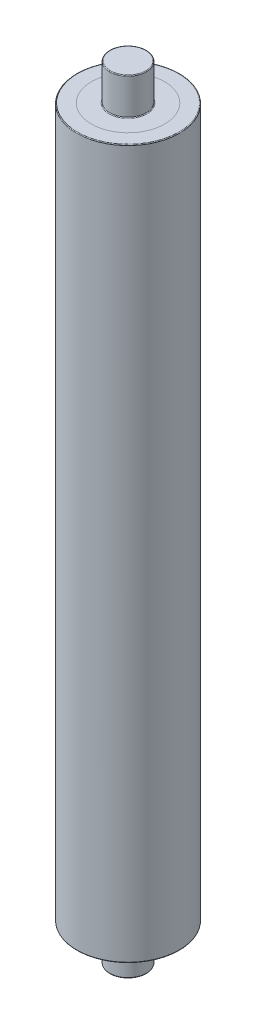
ISO-10303-21;
HEADER;
FILE_DESCRIPTION(('STEP AP214'),'2;1');
FILE_NAME('part.step','',(''),(''),'','','');
FILE_SCHEMA(('AUTOMOTIVE_DESIGN { 1 0 10303 214 1 1 1 1 }'));
ENDSEC;
DATA;
#1=APPLICATION_CONTEXT('core data for automotive mechanical design processes');
#2=APPLICATION_PROTOCOL_DEFINITION('international standard','automotive_design',2000,#1);
#3=PRODUCT_CONTEXT('',#1,'mechanical');
#4=PRODUCT('Part','Part','',(#3));
#5=PRODUCT_RELATED_PRODUCT_CATEGORY('part','',(#4));
#6=PRODUCT_DEFINITION_FORMATION('','',#4);
#7=PRODUCT_DEFINITION_CONTEXT('part definition',#1,'design');
#8=PRODUCT_DEFINITION('design','',#6,#7);
#9=PRODUCT_DEFINITION_SHAPE('','',#8);
#10=(LENGTH_UNIT() NAMED_UNIT(*) SI_UNIT(.MILLI.,.METRE.));
#11=(NAMED_UNIT(*) PLANE_ANGLE_UNIT() SI_UNIT($,.RADIAN.));
#12=(NAMED_UNIT(*) SI_UNIT($,.STERADIAN.) SOLID_ANGLE_UNIT());
#13=UNCERTAINTY_MEASURE_WITH_UNIT(LENGTH_MEASURE(1.E-05),#10,'distance_accuracy_value','');
#14=(GEOMETRIC_REPRESENTATION_CONTEXT(3) GLOBAL_UNCERTAINTY_ASSIGNED_CONTEXT((#13)) GLOBAL_UNIT_ASSIGNED_CONTEXT((#10,
#11,#12)) REPRESENTATION_CONTEXT('',''));
#15=CARTESIAN_POINT('',(0.,0.,0.));
#16=DIRECTION('',(0.,0.,1.));
#17=DIRECTION('',(1.,0.,0.));
#18=AXIS2_PLACEMENT_3D('',#15,#16,#17);
#19=CARTESIAN_POINT('',(7.50000000000008,305.,0.));
#20=DIRECTION('',(0.,1.,0.));
#21=DIRECTION('',(0.,0.,1.));
#22=AXIS2_PLACEMENT_3D('',#19,#20,#21);
#23=PLANE('',#22);
#24=CARTESIAN_POINT('',(0.,305.,0.));
#25=DIRECTION('',(0.,1.,0.));
#26=DIRECTION('',(0.,0.,1.));
#27=AXIS2_PLACEMENT_3D('',#24,#25,#26);
#28=CIRCLE('',#27,20.7);
#29=CARTESIAN_POINT('',(0.,305.,20.7));
#30=VERTEX_POINT('',#29);
#31=EDGE_CURVE('E77',#30,#30,#28,.T.);
#32=ORIENTED_EDGE('',*,*,#31,.T.);
#33=EDGE_LOOP('',(#32));
#34=FACE_BOUND('',#33,.T.);
#35=CARTESIAN_POINT('',(0.,305.,0.));
#36=DIRECTION('',(0.,-1.,0.));
#37=DIRECTION('',(0.,0.,1.));
#38=AXIS2_PLACEMENT_3D('',#35,#36,#37);
#39=CIRCLE('',#38,15.);
#40=CARTESIAN_POINT('',(0.,305.,15.));
#41=VERTEX_POINT('',#40);
#42=EDGE_CURVE('E41',#41,#41,#39,.T.);
#43=ORIENTED_EDGE('',*,*,#42,.T.);
#44=EDGE_LOOP('',(#43));
#45=FACE_BOUND('',#44,.T.);
#46=ADVANCED_FACE('F66',(#34,#45),#23,.T.);
#47=CARTESIAN_POINT('',(21.,15.,0.));
#48=DIRECTION('',(0.,-1.,0.));
#49=DIRECTION('',(0.,0.,-1.));
#50=AXIS2_PLACEMENT_3D('',#47,#48,#49);
#51=PLANE('',#50);
#52=CARTESIAN_POINT('',(0.,15.,0.));
#53=DIRECTION('',(0.,-1.,0.));
#54=DIRECTION('',(0.,0.,-1.));
#55=AXIS2_PLACEMENT_3D('',#52,#53,#54);
#56=CIRCLE('',#55,20.7);
#57=CARTESIAN_POINT('',(0.,15.,-20.7));
#58=VERTEX_POINT('',#57);
#59=EDGE_CURVE('E104',#58,#58,#56,.T.);
#60=ORIENTED_EDGE('',*,*,#59,.T.);
#61=EDGE_LOOP('',(#60));
#62=FACE_BOUND('',#61,.T.);
#63=CARTESIAN_POINT('',(0.,15.,0.));
#64=DIRECTION('',(0.,1.,0.));
#65=DIRECTION('',(0.,0.,-1.));
#66=AXIS2_PLACEMENT_3D('',#63,#64,#65);
#67=CIRCLE('',#66,15.);
#68=CARTESIAN_POINT('',(0.,15.,-15.));
#69=VERTEX_POINT('',#68);
#70=EDGE_CURVE('E73',#69,#69,#67,.T.);
#71=ORIENTED_EDGE('',*,*,#70,.T.);
#72=EDGE_LOOP('',(#71));
#73=FACE_BOUND('',#72,.T.);
#74=ADVANCED_FACE('F138',(#62,#73),#51,.T.);
#75=CARTESIAN_POINT('',(7.5,0.,0.));
#76=DIRECTION('',(0.,-1.,0.));
#77=DIRECTION('',(0.,0.,-1.));
#78=AXIS2_PLACEMENT_3D('',#75,#76,#77);
#79=PLANE('',#78);
#80=CARTESIAN_POINT('',(0.,0.,0.));
#81=DIRECTION('',(0.,-1.,0.));
#82=DIRECTION('',(0.,0.,-1.));
#83=AXIS2_PLACEMENT_3D('',#80,#81,#82);
#84=CIRCLE('',#83,7.2);
#85=CARTESIAN_POINT('',(0.,0.,-7.2));
#86=VERTEX_POINT('',#85);
#87=EDGE_CURVE('E113',#86,#86,#84,.T.);
#88=ORIENTED_EDGE('',*,*,#87,.T.);
#89=EDGE_LOOP('',(#88));
#90=FACE_BOUND('',#89,.T.);
#91=ADVANCED_FACE('F117',(#90),#79,.T.);
#92=CARTESIAN_POINT('',(0.,320.,0.));
#93=DIRECTION('',(0.,1.,0.));
#94=DIRECTION('',(0.,0.,1.));
#95=AXIS2_PLACEMENT_3D('',#92,#93,#94);
#96=PLANE('',#95);
#97=CARTESIAN_POINT('',(0.,320.,0.));
#98=DIRECTION('',(0.,1.,0.));
#99=DIRECTION('',(0.,0.,1.));
#100=AXIS2_PLACEMENT_3D('',#97,#98,#99);
#101=CIRCLE('',#100,7.20000000000008);
#102=CARTESIAN_POINT('',(0.,320.,7.20000000000008));
#103=VERTEX_POINT('',#102);
#104=EDGE_CURVE('E86',#103,#103,#101,.T.);
#105=ORIENTED_EDGE('',*,*,#104,.T.);
#106=EDGE_LOOP('',(#105));
#107=FACE_BOUND('',#106,.T.);
#108=ADVANCED_FACE('F158',(#107),#96,.T.);
#109=CARTESIAN_POINT('',(0.,0.,0.));
#110=DIRECTION('',(0.,-1.,0.));
#111=DIRECTION('',(0.,0.,-1.));
#112=AXIS2_PLACEMENT_3D('',#109,#110,#111);
#113=CYLINDRICAL_SURFACE('',#112,7.50000000000008);
#114=CARTESIAN_POINT('',(0.,319.7,0.));
#115=DIRECTION('',(0.,1.,0.));
#116=DIRECTION('',(0.,0.,1.));
#117=AXIS2_PLACEMENT_3D('',#114,#115,#116);
#118=CIRCLE('',#117,7.50000000000008);
#119=CARTESIAN_POINT('',(0.,319.7,7.50000000000008));
#120=VERTEX_POINT('',#119);
#121=EDGE_CURVE('E89',#120,#120,#118,.F.);
#122=ORIENTED_EDGE('',*,*,#121,.T.);
#123=EDGE_LOOP('',(#122));
#124=FACE_BOUND('',#123,.T.);
#125=CARTESIAN_POINT('',(0.,305.3,0.));
#126=DIRECTION('',(0.,1.,0.));
#127=DIRECTION('',(0.,0.,1.));
#128=AXIS2_PLACEMENT_3D('',#125,#126,#127);
#129=CIRCLE('',#128,7.50000000000008);
#130=CARTESIAN_POINT('',(0.,305.3,7.50000000000008));
#131=VERTEX_POINT('',#130);
#132=EDGE_CURVE('E92',#131,#131,#129,.T.);
#133=ORIENTED_EDGE('',*,*,#132,.T.);
#134=EDGE_LOOP('',(#133));
#135=FACE_BOUND('',#134,.T.);
#136=ADVANCED_FACE('F151',(#124,#135),#113,.T.);
#137=ORIENTED_EDGE('',*,*,#42,.F.);
#138=EDGE_LOOP('',(#137));
#139=FACE_BOUND('',#138,.T.);
#140=CARTESIAN_POINT('',(0.,305.,0.));
#141=DIRECTION('',(0.,1.,0.));
#142=DIRECTION('',(0.,0.,1.));
#143=AXIS2_PLACEMENT_3D('',#140,#141,#142);
#144=CIRCLE('',#143,7.80000000000008);
#145=CARTESIAN_POINT('',(0.,305.,7.80000000000008));
#146=VERTEX_POINT('',#145);
#147=EDGE_CURVE('E81',#146,#146,#144,.F.);
#148=ORIENTED_EDGE('',*,*,#147,.T.);
#149=EDGE_LOOP('',(#148));
#150=FACE_BOUND('',#149,.T.);
#151=ADVANCED_FACE('F141',(#139,#150),#23,.T.);
#152=CARTESIAN_POINT('',(0.,0.,0.));
#153=DIRECTION('',(0.,-1.,0.));
#154=DIRECTION('',(0.,0.,-1.));
#155=AXIS2_PLACEMENT_3D('',#152,#153,#154);
#156=CYLINDRICAL_SURFACE('',#155,21.);
#157=CARTESIAN_POINT('',(0.,15.3,0.));
#158=DIRECTION('',(0.,-1.,0.));
#159=DIRECTION('',(0.,0.,-1.));
#160=AXIS2_PLACEMENT_3D('',#157,#158,#159);
#161=CIRCLE('',#160,21.);
#162=CARTESIAN_POINT('',(0.,15.3,-21.));
#163=VERTEX_POINT('',#162);
#164=EDGE_CURVE('E95',#163,#163,#161,.F.);
#165=ORIENTED_EDGE('',*,*,#164,.T.);
#166=EDGE_LOOP('',(#165));
#167=FACE_BOUND('',#166,.T.);
#168=CARTESIAN_POINT('',(0.,304.7,0.));
#169=DIRECTION('',(0.,1.,0.));
#170=DIRECTION('',(0.,0.,1.));
#171=AXIS2_PLACEMENT_3D('',#168,#169,#170);
#172=CIRCLE('',#171,21.);
#173=CARTESIAN_POINT('',(0.,304.7,21.));
#174=VERTEX_POINT('',#173);
#175=EDGE_CURVE('E98',#174,#174,#172,.F.);
#176=ORIENTED_EDGE('',*,*,#175,.T.);
#177=EDGE_LOOP('',(#176));
#178=FACE_BOUND('',#177,.T.);
#179=ADVANCED_FACE('F150',(#167,#178),#156,.T.);
#180=ORIENTED_EDGE('',*,*,#70,.F.);
#181=EDGE_LOOP('',(#180));
#182=FACE_BOUND('',#181,.T.);
#183=CARTESIAN_POINT('',(0.,15.,0.));
#184=DIRECTION('',(0.,-1.,0.));
#185=DIRECTION('',(0.,0.,-1.));
#186=AXIS2_PLACEMENT_3D('',#183,#184,#185);
#187=CIRCLE('',#186,7.8);
#188=CARTESIAN_POINT('',(0.,15.,-7.8));
#189=VERTEX_POINT('',#188);
#190=EDGE_CURVE('E101',#189,#189,#187,.F.);
#191=ORIENTED_EDGE('',*,*,#190,.T.);
#192=EDGE_LOOP('',(#191));
#193=FACE_BOUND('',#192,.T.);
#194=ADVANCED_FACE('F132',(#182,#193),#51,.T.);
#195=CARTESIAN_POINT('',(0.,0.,0.));
#196=DIRECTION('',(0.,-1.,0.));
#197=DIRECTION('',(0.,0.,-1.));
#198=AXIS2_PLACEMENT_3D('',#195,#196,#197);
#199=CYLINDRICAL_SURFACE('',#198,7.5);
#200=CARTESIAN_POINT('',(0.,0.3,0.));
#201=DIRECTION('',(0.,-1.,0.));
#202=DIRECTION('',(0.,0.,-1.));
#203=AXIS2_PLACEMENT_3D('',#200,#201,#202);
#204=CIRCLE('',#203,7.5);
#205=CARTESIAN_POINT('',(0.,0.3,-7.5));
#206=VERTEX_POINT('',#205);
#207=EDGE_CURVE('E107',#206,#206,#204,.F.);
#208=ORIENTED_EDGE('',*,*,#207,.T.);
#209=EDGE_LOOP('',(#208));
#210=FACE_BOUND('',#209,.T.);
#211=CARTESIAN_POINT('',(0.,14.7,0.));
#212=DIRECTION('',(0.,-1.,0.));
#213=DIRECTION('',(0.,0.,-1.));
#214=AXIS2_PLACEMENT_3D('',#211,#212,#213);
#215=CIRCLE('',#214,7.5);
#216=CARTESIAN_POINT('',(0.,14.7,-7.5));
#217=VERTEX_POINT('',#216);
#218=EDGE_CURVE('E110',#217,#217,#215,.T.);
#219=ORIENTED_EDGE('',*,*,#218,.T.);
#220=EDGE_LOOP('',(#219));
#221=FACE_BOUND('',#220,.T.);
#222=ADVANCED_FACE('F122',(#210,#221),#199,.T.);
#223=CARTESIAN_POINT('',(0.,0.3,0.));
#224=DIRECTION('',(0.,-1.,0.));
#225=DIRECTION('',(0.,0.,-1.));
#226=AXIS2_PLACEMENT_3D('',#223,#224,#225);
#227=TOROIDAL_SURFACE('',#226,7.2,0.3);
#228=ORIENTED_EDGE('',*,*,#207,.F.);
#229=EDGE_LOOP('',(#228));
#230=FACE_BOUND('',#229,.T.);
#231=ORIENTED_EDGE('',*,*,#87,.F.);
#232=EDGE_LOOP('',(#231));
#233=FACE_BOUND('',#232,.T.);
#234=ADVANCED_FACE('F119',(#230,#233),#227,.T.);
#235=CARTESIAN_POINT('',(0.,14.7,0.));
#236=DIRECTION('',(0.,-1.,0.));
#237=DIRECTION('',(0.,0.,-1.));
#238=AXIS2_PLACEMENT_3D('',#235,#236,#237);
#239=TOROIDAL_SURFACE('',#238,7.8,0.3);
#240=ORIENTED_EDGE('',*,*,#190,.F.);
#241=EDGE_LOOP('',(#240));
#242=FACE_BOUND('',#241,.T.);
#243=ORIENTED_EDGE('',*,*,#218,.F.);
#244=EDGE_LOOP('',(#243));
#245=FACE_BOUND('',#244,.T.);
#246=ADVANCED_FACE('F121',(#242,#245),#239,.F.);
#247=CARTESIAN_POINT('',(0.,15.3,0.));
#248=DIRECTION('',(0.,-1.,0.));
#249=DIRECTION('',(0.,0.,-1.));
#250=AXIS2_PLACEMENT_3D('',#247,#248,#249);
#251=TOROIDAL_SURFACE('',#250,20.7,0.3);
#252=ORIENTED_EDGE('',*,*,#164,.F.);
#253=EDGE_LOOP('',(#252));
#254=FACE_BOUND('',#253,.T.);
#255=ORIENTED_EDGE('',*,*,#59,.F.);
#256=EDGE_LOOP('',(#255));
#257=FACE_BOUND('',#256,.T.);
#258=ADVANCED_FACE('F129',(#254,#257),#251,.T.);
#259=CARTESIAN_POINT('',(0.,319.7,0.));
#260=DIRECTION('',(0.,1.,0.));
#261=DIRECTION('',(0.,0.,1.));
#262=AXIS2_PLACEMENT_3D('',#259,#260,#261);
#263=TOROIDAL_SURFACE('',#262,7.20000000000008,0.3);
#264=ORIENTED_EDGE('',*,*,#104,.F.);
#265=EDGE_LOOP('',(#264));
#266=FACE_BOUND('',#265,.T.);
#267=ORIENTED_EDGE('',*,*,#121,.F.);
#268=EDGE_LOOP('',(#267));
#269=FACE_BOUND('',#268,.T.);
#270=ADVANCED_FACE('F169',(#266,#269),#263,.T.);
#271=CARTESIAN_POINT('',(0.,304.7,0.));
#272=DIRECTION('',(0.,1.,0.));
#273=DIRECTION('',(0.,0.,1.));
#274=AXIS2_PLACEMENT_3D('',#271,#272,#273);
#275=TOROIDAL_SURFACE('',#274,20.7,0.3);
#276=ORIENTED_EDGE('',*,*,#31,.F.);
#277=EDGE_LOOP('',(#276));
#278=FACE_BOUND('',#277,.T.);
#279=ORIENTED_EDGE('',*,*,#175,.F.);
#280=EDGE_LOOP('',(#279));
#281=FACE_BOUND('',#280,.T.);
#282=ADVANCED_FACE('F164',(#278,#281),#275,.T.);
#283=CARTESIAN_POINT('',(0.,305.3,0.));
#284=DIRECTION('',(0.,1.,0.));
#285=DIRECTION('',(0.,0.,1.));
#286=AXIS2_PLACEMENT_3D('',#283,#284,#285);
#287=TOROIDAL_SURFACE('',#286,7.80000000000008,0.3);
#288=ORIENTED_EDGE('',*,*,#132,.F.);
#289=EDGE_LOOP('',(#288));
#290=FACE_BOUND('',#289,.T.);
#291=ORIENTED_EDGE('',*,*,#147,.F.);
#292=EDGE_LOOP('',(#291));
#293=FACE_BOUND('',#292,.T.);
#294=ADVANCED_FACE('F68',(#290,#293),#287,.F.);
#295=CLOSED_SHELL('',(#46,#74,#91,#108,#136,#151,#179,#194,#222,#234,#246,#258,#270,#282,#294));
#296=MANIFOLD_SOLID_BREP('B6',#295);
#297=ADVANCED_BREP_SHAPE_REPRESENTATION('',(#18,#296),#14);
#298=SHAPE_DEFINITION_REPRESENTATION(#9,#297);
ENDSEC;
END-ISO-10303-21;
